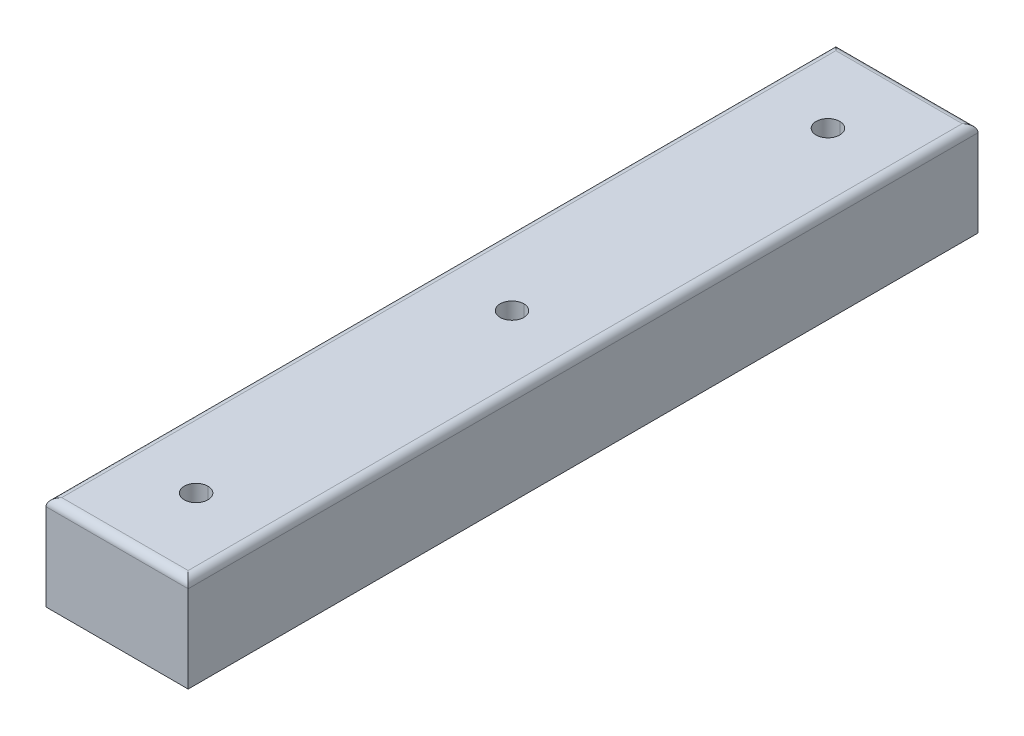
ISO-10303-21;
HEADER;
FILE_DESCRIPTION(('STEP AP214'),'2;1');
FILE_NAME('part.step','',(''),(''),'','','');
FILE_SCHEMA(('AUTOMOTIVE_DESIGN { 1 0 10303 214 1 1 1 1 }'));
ENDSEC;
DATA;
#1=APPLICATION_CONTEXT('core data for automotive mechanical design processes');
#2=APPLICATION_PROTOCOL_DEFINITION('international standard','automotive_design',2000,#1);
#3=PRODUCT_CONTEXT('',#1,'mechanical');
#4=PRODUCT('Part','Part','',(#3));
#5=PRODUCT_RELATED_PRODUCT_CATEGORY('part','',(#4));
#6=PRODUCT_DEFINITION_FORMATION('','',#4);
#7=PRODUCT_DEFINITION_CONTEXT('part definition',#1,'design');
#8=PRODUCT_DEFINITION('design','',#6,#7);
#9=PRODUCT_DEFINITION_SHAPE('','',#8);
#10=(LENGTH_UNIT() NAMED_UNIT(*) SI_UNIT(.MILLI.,.METRE.));
#11=(NAMED_UNIT(*) PLANE_ANGLE_UNIT() SI_UNIT($,.RADIAN.));
#12=(NAMED_UNIT(*) SI_UNIT($,.STERADIAN.) SOLID_ANGLE_UNIT());
#13=UNCERTAINTY_MEASURE_WITH_UNIT(LENGTH_MEASURE(1.E-05),#10,'distance_accuracy_value','');
#14=(GEOMETRIC_REPRESENTATION_CONTEXT(3) GLOBAL_UNCERTAINTY_ASSIGNED_CONTEXT((#13)) GLOBAL_UNIT_ASSIGNED_CONTEXT((#10,
#11,#12)) REPRESENTATION_CONTEXT('',''));
#15=CARTESIAN_POINT('',(0.,0.,0.));
#16=DIRECTION('',(0.,0.,1.));
#17=DIRECTION('',(1.,0.,0.));
#18=AXIS2_PLACEMENT_3D('',#15,#16,#17);
#19=CARTESIAN_POINT('',(0.,-40.,100.));
#20=DIRECTION('',(0.,1.,0.));
#21=DIRECTION('',(1.,0.,0.));
#22=AXIS2_PLACEMENT_3D('',#19,#20,#21);
#23=PLANE('',#22);
#24=CARTESIAN_POINT('',(0.,-40.,100.));
#25=DIRECTION('',(0.,1.,0.));
#26=DIRECTION('',(0.,0.,1.));
#27=AXIS2_PLACEMENT_3D('',#24,#25,#26);
#28=CIRCLE('',#27,15.);
#29=CARTESIAN_POINT('',(0.,-40.,115.));
#30=VERTEX_POINT('',#29);
#31=CARTESIAN_POINT('',(0.,-40.,85.));
#32=VERTEX_POINT('',#31);
#33=EDGE_CURVE('E11',#30,#32,#28,.T.);
#34=ORIENTED_EDGE('',*,*,#33,.T.);
#35=CARTESIAN_POINT('',(0.,-40.,100.));
#36=DIRECTION('',(0.,1.,0.));
#37=DIRECTION('',(0.,0.,1.));
#38=AXIS2_PLACEMENT_3D('',#35,#36,#37);
#39=CIRCLE('',#38,15.);
#40=EDGE_CURVE('E208',#32,#30,#39,.T.);
#41=ORIENTED_EDGE('',*,*,#40,.T.);
#42=EDGE_LOOP('',(#34,#41));
#43=FACE_BOUND('',#42,.T.);
#44=ADVANCED_FACE('F17',(#43),#23,.T.);
#45=CARTESIAN_POINT('',(0.,-40.,100.));
#46=DIRECTION('',(0.,1.,0.));
#47=DIRECTION('',(0.,0.,1.));
#48=AXIS2_PLACEMENT_3D('',#45,#46,#47);
#49=CYLINDRICAL_SURFACE('',#48,15.);
#50=DIRECTION('',(0.,1.,0.));
#51=VECTOR('',#50,1.);
#52=CARTESIAN_POINT('',(0.,-40.,85.));
#53=LINE('',#52,#51);
#54=CARTESIAN_POINT('',(0.,60.,85.));
#55=VERTEX_POINT('',#54);
#56=EDGE_CURVE('E212',#32,#55,#53,.T.);
#57=ORIENTED_EDGE('',*,*,#56,.F.);
#58=ORIENTED_EDGE('',*,*,#33,.F.);
#59=DIRECTION('',(0.,1.,0.));
#60=VECTOR('',#59,1.);
#61=CARTESIAN_POINT('',(0.,-40.,115.));
#62=LINE('',#61,#60);
#63=CARTESIAN_POINT('',(0.,60.,115.));
#64=VERTEX_POINT('',#63);
#65=EDGE_CURVE('E189',#30,#64,#62,.T.);
#66=ORIENTED_EDGE('',*,*,#65,.T.);
#67=CARTESIAN_POINT('',(0.,60.,100.));
#68=DIRECTION('',(0.,1.,0.));
#69=DIRECTION('',(0.,0.,1.));
#70=AXIS2_PLACEMENT_3D('',#67,#68,#69);
#71=CIRCLE('',#70,15.);
#72=EDGE_CURVE('E117',#64,#55,#71,.T.);
#73=ORIENTED_EDGE('',*,*,#72,.T.);
#74=EDGE_LOOP('',(#57,#58,#66,#73));
#75=FACE_BOUND('',#74,.T.);
#76=ADVANCED_FACE('F441',(#75),#49,.F.);
#77=CARTESIAN_POINT('',(0.,-40.,500.));
#78=DIRECTION('',(0.,1.,0.));
#79=DIRECTION('',(1.,0.,0.));
#80=AXIS2_PLACEMENT_3D('',#77,#78,#79);
#81=PLANE('',#80);
#82=CARTESIAN_POINT('',(0.,-40.,500.));
#83=DIRECTION('',(0.,1.,0.));
#84=DIRECTION('',(0.,0.,1.));
#85=AXIS2_PLACEMENT_3D('',#82,#83,#84);
#86=CIRCLE('',#85,15.);
#87=CARTESIAN_POINT('',(0.,-40.,515.));
#88=VERTEX_POINT('',#87);
#89=CARTESIAN_POINT('',(0.,-40.,485.));
#90=VERTEX_POINT('',#89);
#91=EDGE_CURVE('E28',#88,#90,#86,.T.);
#92=ORIENTED_EDGE('',*,*,#91,.T.);
#93=CARTESIAN_POINT('',(0.,-40.,500.));
#94=DIRECTION('',(0.,1.,0.));
#95=DIRECTION('',(0.,0.,1.));
#96=AXIS2_PLACEMENT_3D('',#93,#94,#95);
#97=CIRCLE('',#96,15.);
#98=EDGE_CURVE('E192',#90,#88,#97,.T.);
#99=ORIENTED_EDGE('',*,*,#98,.T.);
#100=EDGE_LOOP('',(#92,#99));
#101=FACE_BOUND('',#100,.T.);
#102=ADVANCED_FACE('F428',(#101),#81,.T.);
#103=CARTESIAN_POINT('',(0.,-40.,500.));
#104=DIRECTION('',(0.,1.,0.));
#105=DIRECTION('',(0.,0.,1.));
#106=AXIS2_PLACEMENT_3D('',#103,#104,#105);
#107=CYLINDRICAL_SURFACE('',#106,15.);
#108=DIRECTION('',(0.,1.,0.));
#109=VECTOR('',#108,1.);
#110=CARTESIAN_POINT('',(0.,-40.,485.));
#111=LINE('',#110,#109);
#112=CARTESIAN_POINT('',(0.,60.,485.));
#113=VERTEX_POINT('',#112);
#114=EDGE_CURVE('E178',#90,#113,#111,.T.);
#115=ORIENTED_EDGE('',*,*,#114,.F.);
#116=ORIENTED_EDGE('',*,*,#91,.F.);
#117=DIRECTION('',(0.,1.,0.));
#118=VECTOR('',#117,1.);
#119=CARTESIAN_POINT('',(0.,-40.,515.));
#120=LINE('',#119,#118);
#121=CARTESIAN_POINT('',(0.,60.,515.));
#122=VERTEX_POINT('',#121);
#123=EDGE_CURVE('E177',#88,#122,#120,.T.);
#124=ORIENTED_EDGE('',*,*,#123,.T.);
#125=CARTESIAN_POINT('',(0.,60.,500.));
#126=DIRECTION('',(0.,1.,0.));
#127=DIRECTION('',(0.,0.,1.));
#128=AXIS2_PLACEMENT_3D('',#125,#126,#127);
#129=CIRCLE('',#128,15.);
#130=EDGE_CURVE('E216',#122,#113,#129,.T.);
#131=ORIENTED_EDGE('',*,*,#130,.T.);
#132=EDGE_LOOP('',(#115,#116,#124,#131));
#133=FACE_BOUND('',#132,.T.);
#134=ADVANCED_FACE('F423',(#133),#107,.F.);
#135=CARTESIAN_POINT('',(0.,-40.,900.));
#136=DIRECTION('',(0.,1.,0.));
#137=DIRECTION('',(1.,0.,0.));
#138=AXIS2_PLACEMENT_3D('',#135,#136,#137);
#139=PLANE('',#138);
#140=CARTESIAN_POINT('',(0.,-40.,900.));
#141=DIRECTION('',(0.,1.,0.));
#142=DIRECTION('',(0.,0.,1.));
#143=AXIS2_PLACEMENT_3D('',#140,#141,#142);
#144=CIRCLE('',#143,15.);
#145=CARTESIAN_POINT('',(0.,-40.,915.));
#146=VERTEX_POINT('',#145);
#147=CARTESIAN_POINT('',(0.,-40.,885.));
#148=VERTEX_POINT('',#147);
#149=EDGE_CURVE('E243',#146,#148,#144,.T.);
#150=ORIENTED_EDGE('',*,*,#149,.T.);
#151=CARTESIAN_POINT('',(0.,-40.,900.));
#152=DIRECTION('',(0.,1.,0.));
#153=DIRECTION('',(0.,0.,1.));
#154=AXIS2_PLACEMENT_3D('',#151,#152,#153);
#155=CIRCLE('',#154,15.);
#156=EDGE_CURVE('E207',#148,#146,#155,.T.);
#157=ORIENTED_EDGE('',*,*,#156,.T.);
#158=EDGE_LOOP('',(#150,#157));
#159=FACE_BOUND('',#158,.T.);
#160=ADVANCED_FACE('F268',(#159),#139,.T.);
#161=CARTESIAN_POINT('',(0.,-40.,900.));
#162=DIRECTION('',(0.,1.,0.));
#163=DIRECTION('',(0.,0.,1.));
#164=AXIS2_PLACEMENT_3D('',#161,#162,#163);
#165=CYLINDRICAL_SURFACE('',#164,15.);
#166=DIRECTION('',(0.,1.,0.));
#167=VECTOR('',#166,1.);
#168=CARTESIAN_POINT('',(0.,-40.,885.));
#169=LINE('',#168,#167);
#170=CARTESIAN_POINT('',(0.,60.,885.));
#171=VERTEX_POINT('',#170);
#172=EDGE_CURVE('E203',#148,#171,#169,.T.);
#173=ORIENTED_EDGE('',*,*,#172,.F.);
#174=ORIENTED_EDGE('',*,*,#149,.F.);
#175=DIRECTION('',(0.,1.,0.));
#176=VECTOR('',#175,1.);
#177=CARTESIAN_POINT('',(0.,-40.,915.));
#178=LINE('',#177,#176);
#179=CARTESIAN_POINT('',(0.,60.,915.));
#180=VERTEX_POINT('',#179);
#181=EDGE_CURVE('E179',#146,#180,#178,.T.);
#182=ORIENTED_EDGE('',*,*,#181,.T.);
#183=CARTESIAN_POINT('',(0.,60.,900.));
#184=DIRECTION('',(0.,1.,0.));
#185=DIRECTION('',(0.,0.,1.));
#186=AXIS2_PLACEMENT_3D('',#183,#184,#185);
#187=CIRCLE('',#186,15.);
#188=EDGE_CURVE('E219',#180,#171,#187,.T.);
#189=ORIENTED_EDGE('',*,*,#188,.T.);
#190=EDGE_LOOP('',(#173,#174,#182,#189));
#191=FACE_BOUND('',#190,.T.);
#192=ADVANCED_FACE('F256',(#191),#165,.F.);
#193=CARTESIAN_POINT('',(80.,50.,1000.));
#194=DIRECTION('',(0.,0.,-1.));
#195=DIRECTION('',(-1.,0.,0.));
#196=AXIS2_PLACEMENT_3D('',#193,#194,#195);
#197=CYLINDRICAL_SURFACE('',#196,10.);
#198=CARTESIAN_POINT('',(80.,60.,990.));
#199=CARTESIAN_POINT('',(85.857864376269,60.,995.85786437627));
#200=CARTESIAN_POINT('',(89.9999999999999,55.857864376269,1000.));
#201=CARTESIAN_POINT('',(90.,50.,1000.));
#202=(BOUNDED_CURVE() B_SPLINE_CURVE(3,(#198,#199,#200,#201),.UNSPECIFIED.,.F.,
.F.) B_SPLINE_CURVE_WITH_KNOTS((4,4),(4.71238898038469,6.28318530717959),
.UNSPECIFIED.) CURVE() GEOMETRIC_REPRESENTATION_ITEM() RATIONAL_B_SPLINE_CURVE((1.,
0.804737854124365,0.804737854124365,1.)) REPRESENTATION_ITEM(''));
#203=CARTESIAN_POINT('',(80.,60.,990.));
#204=VERTEX_POINT('',#203);
#205=CARTESIAN_POINT('',(90.,50.,1000.));
#206=VERTEX_POINT('',#205);
#207=EDGE_CURVE('E234',#204,#206,#202,.T.);
#208=ORIENTED_EDGE('',*,*,#207,.T.);
#209=DIRECTION('',(0.,0.,1.));
#210=VECTOR('',#209,1.);
#211=CARTESIAN_POINT('',(90.,50.,1000.));
#212=LINE('',#211,#210);
#213=CARTESIAN_POINT('',(90.,50.,0.));
#214=VERTEX_POINT('',#213);
#215=EDGE_CURVE('E188',#214,#206,#212,.T.);
#216=ORIENTED_EDGE('',*,*,#215,.F.);
#217=CARTESIAN_POINT('',(90.,50.,0.));
#218=CARTESIAN_POINT('',(89.9999999999999,55.857864376269,0.));
#219=CARTESIAN_POINT('',(85.857864376269,60.,4.14213562373096));
#220=CARTESIAN_POINT('',(80.,60.,10.));
#221=(BOUNDED_CURVE() B_SPLINE_CURVE(3,(#217,#218,#219,#220),.UNSPECIFIED.,.F.,
.F.) B_SPLINE_CURVE_WITH_KNOTS((4,4),(3.1415926535898,4.71238898038469),
.UNSPECIFIED.) CURVE() GEOMETRIC_REPRESENTATION_ITEM() RATIONAL_B_SPLINE_CURVE((1.,
0.804737854124365,0.804737854124365,1.)) REPRESENTATION_ITEM(''));
#222=CARTESIAN_POINT('',(80.,60.,10.));
#223=VERTEX_POINT('',#222);
#224=EDGE_CURVE('E235',#214,#223,#221,.T.);
#225=ORIENTED_EDGE('',*,*,#224,.T.);
#226=DIRECTION('',(0.,0.,-1.));
#227=VECTOR('',#226,1.);
#228=CARTESIAN_POINT('',(80.,60.,1000.));
#229=LINE('',#228,#227);
#230=EDGE_CURVE('E160',#204,#223,#229,.T.);
#231=ORIENTED_EDGE('',*,*,#230,.F.);
#232=EDGE_LOOP('',(#208,#216,#225,#231));
#233=FACE_BOUND('',#232,.T.);
#234=ADVANCED_FACE('F322',(#233),#197,.T.);
#235=CARTESIAN_POINT('',(-90.,50.,10.));
#236=DIRECTION('',(-1.,0.,0.));
#237=DIRECTION('',(0.,0.,1.));
#238=AXIS2_PLACEMENT_3D('',#235,#236,#237);
#239=CYLINDRICAL_SURFACE('',#238,10.);
#240=CARTESIAN_POINT('',(-90.,50.,0.));
#241=CARTESIAN_POINT('',(-90.0000000000001,55.857864376269,0.));
#242=CARTESIAN_POINT('',(-85.857864376269,60.,4.14213562373096));
#243=CARTESIAN_POINT('',(-80.,60.,10.));
#244=(BOUNDED_CURVE() B_SPLINE_CURVE(3,(#240,#241,#242,#243),.UNSPECIFIED.,.F.,
.F.) B_SPLINE_CURVE_WITH_KNOTS((4,4),(0.,1.5707963267949),
.UNSPECIFIED.) CURVE() GEOMETRIC_REPRESENTATION_ITEM() RATIONAL_B_SPLINE_CURVE((1.,
0.804737854124365,0.804737854124365,1.)) REPRESENTATION_ITEM(''));
#245=CARTESIAN_POINT('',(-90.,50.,0.));
#246=VERTEX_POINT('',#245);
#247=CARTESIAN_POINT('',(-80.,60.,10.));
#248=VERTEX_POINT('',#247);
#249=EDGE_CURVE('E135',#246,#248,#244,.T.);
#250=ORIENTED_EDGE('',*,*,#249,.T.);
#251=DIRECTION('',(-1.,0.,0.));
#252=VECTOR('',#251,1.);
#253=CARTESIAN_POINT('',(-90.,60.,10.));
#254=LINE('',#253,#252);
#255=EDGE_CURVE('E139',#223,#248,#254,.T.);
#256=ORIENTED_EDGE('',*,*,#255,.F.);
#257=ORIENTED_EDGE('',*,*,#224,.F.);
#258=DIRECTION('',(1.,0.,0.));
#259=VECTOR('',#258,1.);
#260=CARTESIAN_POINT('',(0.,50.,0.));
#261=LINE('',#260,#259);
#262=EDGE_CURVE('E142',#246,#214,#261,.T.);
#263=ORIENTED_EDGE('',*,*,#262,.F.);
#264=EDGE_LOOP('',(#250,#256,#257,#263));
#265=FACE_BOUND('',#264,.T.);
#266=ADVANCED_FACE('F137',(#265),#239,.T.);
#267=CARTESIAN_POINT('',(0.,50.,990.));
#268=DIRECTION('',(1.,0.,0.));
#269=DIRECTION('',(0.,0.,-1.));
#270=AXIS2_PLACEMENT_3D('',#267,#268,#269);
#271=CYLINDRICAL_SURFACE('',#270,10.);
#272=CARTESIAN_POINT('',(-80.,60.,990.));
#273=CARTESIAN_POINT('',(-85.857864376269,60.,995.85786437627));
#274=CARTESIAN_POINT('',(-90.0000000000001,55.857864376269,1000.));
#275=CARTESIAN_POINT('',(-90.,50.,1000.));
#276=(BOUNDED_CURVE() B_SPLINE_CURVE(3,(#272,#273,#274,#275),.UNSPECIFIED.,.F.,
.F.) B_SPLINE_CURVE_WITH_KNOTS((4,4),(1.5707963267949,3.1415926535898),
.UNSPECIFIED.) CURVE() GEOMETRIC_REPRESENTATION_ITEM() RATIONAL_B_SPLINE_CURVE((1.,
0.804737854124365,0.804737854124365,1.)) REPRESENTATION_ITEM(''));
#277=CARTESIAN_POINT('',(-80.,60.,990.));
#278=VERTEX_POINT('',#277);
#279=CARTESIAN_POINT('',(-90.,50.,1000.));
#280=VERTEX_POINT('',#279);
#281=EDGE_CURVE('E146',#278,#280,#276,.T.);
#282=ORIENTED_EDGE('',*,*,#281,.T.);
#283=DIRECTION('',(-1.,0.,0.));
#284=VECTOR('',#283,1.);
#285=CARTESIAN_POINT('',(-90.,50.,1000.));
#286=LINE('',#285,#284);
#287=EDGE_CURVE('E198',#206,#280,#286,.T.);
#288=ORIENTED_EDGE('',*,*,#287,.F.);
#289=ORIENTED_EDGE('',*,*,#207,.F.);
#290=DIRECTION('',(1.,0.,0.));
#291=VECTOR('',#290,1.);
#292=CARTESIAN_POINT('',(90.,60.,990.));
#293=LINE('',#292,#291);
#294=EDGE_CURVE('E168',#278,#204,#293,.T.);
#295=ORIENTED_EDGE('',*,*,#294,.F.);
#296=EDGE_LOOP('',(#282,#288,#289,#295));
#297=FACE_BOUND('',#296,.T.);
#298=ADVANCED_FACE('F324',(#297),#271,.T.);
#299=CARTESIAN_POINT('',(-80.,50.,1000.));
#300=DIRECTION('',(0.,0.,-1.));
#301=DIRECTION('',(-1.,0.,0.));
#302=AXIS2_PLACEMENT_3D('',#299,#300,#301);
#303=CYLINDRICAL_SURFACE('',#302,10.);
#304=ORIENTED_EDGE('',*,*,#249,.F.);
#305=DIRECTION('',(0.,0.,-1.));
#306=VECTOR('',#305,1.);
#307=CARTESIAN_POINT('',(-90.,50.,1000.));
#308=LINE('',#307,#306);
#309=EDGE_CURVE('E224',#280,#246,#308,.T.);
#310=ORIENTED_EDGE('',*,*,#309,.F.);
#311=ORIENTED_EDGE('',*,*,#281,.F.);
#312=DIRECTION('',(0.,0.,1.));
#313=VECTOR('',#312,1.);
#314=CARTESIAN_POINT('',(-80.,60.,1000.));
#315=LINE('',#314,#313);
#316=EDGE_CURVE('E150',#248,#278,#315,.T.);
#317=ORIENTED_EDGE('',*,*,#316,.F.);
#318=EDGE_LOOP('',(#304,#310,#311,#317));
#319=FACE_BOUND('',#318,.T.);
#320=ADVANCED_FACE('F151',(#319),#303,.T.);
#321=CARTESIAN_POINT('',(0.,0.,0.));
#322=DIRECTION('',(0.,0.,1.));
#323=DIRECTION('',(1.,0.,0.));
#324=AXIS2_PLACEMENT_3D('',#321,#322,#323);
#325=PLANE('',#324);
#326=DIRECTION('',(0.,-1.,0.));
#327=VECTOR('',#326,1.);
#328=CARTESIAN_POINT('',(-90.,60.,0.));
#329=LINE('',#328,#327);
#330=CARTESIAN_POINT('',(-90.,-60.,0.));
#331=VERTEX_POINT('',#330);
#332=EDGE_CURVE('E279',#246,#331,#329,.T.);
#333=ORIENTED_EDGE('',*,*,#332,.F.);
#334=ORIENTED_EDGE('',*,*,#262,.T.);
#335=DIRECTION('',(0.,1.,0.));
#336=VECTOR('',#335,1.);
#337=CARTESIAN_POINT('',(90.,60.,0.));
#338=LINE('',#337,#336);
#339=CARTESIAN_POINT('',(90.,-60.,0.));
#340=VERTEX_POINT('',#339);
#341=EDGE_CURVE('E183',#340,#214,#338,.T.);
#342=ORIENTED_EDGE('',*,*,#341,.F.);
#343=DIRECTION('',(1.,0.,0.));
#344=VECTOR('',#343,1.);
#345=CARTESIAN_POINT('',(-90.,-60.,0.));
#346=LINE('',#345,#344);
#347=EDGE_CURVE('E43',#331,#340,#346,.T.);
#348=ORIENTED_EDGE('',*,*,#347,.F.);
#349=EDGE_LOOP('',(#333,#334,#342,#348));
#350=FACE_BOUND('',#349,.T.);
#351=ADVANCED_FACE('F332',(#350),#325,.F.);
#352=CARTESIAN_POINT('',(0.,0.,1000.));
#353=DIRECTION('',(0.,0.,1.));
#354=DIRECTION('',(1.,0.,0.));
#355=AXIS2_PLACEMENT_3D('',#352,#353,#354);
#356=PLANE('',#355);
#357=DIRECTION('',(0.,1.,0.));
#358=VECTOR('',#357,1.);
#359=CARTESIAN_POINT('',(90.,60.,1000.));
#360=LINE('',#359,#358);
#361=CARTESIAN_POINT('',(90.,-60.,1000.));
#362=VERTEX_POINT('',#361);
#363=EDGE_CURVE('E194',#362,#206,#360,.T.);
#364=ORIENTED_EDGE('',*,*,#363,.T.);
#365=ORIENTED_EDGE('',*,*,#287,.T.);
#366=DIRECTION('',(0.,-1.,0.));
#367=VECTOR('',#366,1.);
#368=CARTESIAN_POINT('',(-90.,60.,1000.));
#369=LINE('',#368,#367);
#370=CARTESIAN_POINT('',(-90.,-60.,1000.));
#371=VERTEX_POINT('',#370);
#372=EDGE_CURVE('E220',#280,#371,#369,.T.);
#373=ORIENTED_EDGE('',*,*,#372,.T.);
#374=DIRECTION('',(1.,0.,0.));
#375=VECTOR('',#374,1.);
#376=CARTESIAN_POINT('',(-90.,-60.,1000.));
#377=LINE('',#376,#375);
#378=EDGE_CURVE('E201',#371,#362,#377,.T.);
#379=ORIENTED_EDGE('',*,*,#378,.T.);
#380=EDGE_LOOP('',(#364,#365,#373,#379));
#381=FACE_BOUND('',#380,.T.);
#382=ADVANCED_FACE('F327',(#381),#356,.T.);
#383=CARTESIAN_POINT('',(-90.,-60.,1000.));
#384=DIRECTION('',(0.,1.,0.));
#385=DIRECTION('',(1.,0.,0.));
#386=AXIS2_PLACEMENT_3D('',#383,#384,#385);
#387=PLANE('',#386);
#388=ORIENTED_EDGE('',*,*,#347,.T.);
#389=DIRECTION('',(0.,0.,-1.));
#390=VECTOR('',#389,1.);
#391=CARTESIAN_POINT('',(90.,-60.,1000.));
#392=LINE('',#391,#390);
#393=EDGE_CURVE('E172',#362,#340,#392,.T.);
#394=ORIENTED_EDGE('',*,*,#393,.F.);
#395=ORIENTED_EDGE('',*,*,#378,.F.);
#396=DIRECTION('',(0.,0.,-1.));
#397=VECTOR('',#396,1.);
#398=CARTESIAN_POINT('',(-90.,-60.,1000.));
#399=LINE('',#398,#397);
#400=EDGE_CURVE('E21',#371,#331,#399,.T.);
#401=ORIENTED_EDGE('',*,*,#400,.T.);
#402=EDGE_LOOP('',(#388,#394,#395,#401));
#403=FACE_BOUND('',#402,.T.);
#404=ADVANCED_FACE('F364',(#403),#387,.F.);
#405=CARTESIAN_POINT('',(-90.,60.,1000.));
#406=DIRECTION('',(1.,0.,0.));
#407=DIRECTION('',(0.,1.,0.));
#408=AXIS2_PLACEMENT_3D('',#405,#406,#407);
#409=PLANE('',#408);
#410=ORIENTED_EDGE('',*,*,#372,.F.);
#411=ORIENTED_EDGE('',*,*,#309,.T.);
#412=ORIENTED_EDGE('',*,*,#332,.T.);
#413=ORIENTED_EDGE('',*,*,#400,.F.);
#414=EDGE_LOOP('',(#410,#411,#412,#413));
#415=FACE_BOUND('',#414,.T.);
#416=ADVANCED_FACE('F337',(#415),#409,.F.);
#417=CARTESIAN_POINT('',(-90.,60.,1000.));
#418=DIRECTION('',(0.,-1.,0.));
#419=DIRECTION('',(0.,0.,-1.));
#420=AXIS2_PLACEMENT_3D('',#417,#418,#419);
#421=PLANE('',#420);
#422=ORIENTED_EDGE('',*,*,#188,.F.);
#423=CARTESIAN_POINT('',(0.,60.,900.));
#424=DIRECTION('',(0.,1.,0.));
#425=DIRECTION('',(0.,0.,1.));
#426=AXIS2_PLACEMENT_3D('',#423,#424,#425);
#427=CIRCLE('',#426,15.);
#428=EDGE_CURVE('E184',#171,#180,#427,.T.);
#429=ORIENTED_EDGE('',*,*,#428,.F.);
#430=EDGE_LOOP('',(#422,#429));
#431=FACE_BOUND('',#430,.T.);
#432=ORIENTED_EDGE('',*,*,#130,.F.);
#433=CARTESIAN_POINT('',(0.,60.,500.));
#434=DIRECTION('',(0.,1.,0.));
#435=DIRECTION('',(0.,0.,1.));
#436=AXIS2_PLACEMENT_3D('',#433,#434,#435);
#437=CIRCLE('',#436,15.);
#438=EDGE_CURVE('E174',#113,#122,#437,.T.);
#439=ORIENTED_EDGE('',*,*,#438,.F.);
#440=EDGE_LOOP('',(#432,#439));
#441=FACE_BOUND('',#440,.T.);
#442=ORIENTED_EDGE('',*,*,#72,.F.);
#443=CARTESIAN_POINT('',(0.,60.,100.));
#444=DIRECTION('',(0.,1.,0.));
#445=DIRECTION('',(0.,0.,1.));
#446=AXIS2_PLACEMENT_3D('',#443,#444,#445);
#447=CIRCLE('',#446,15.);
#448=EDGE_CURVE('E193',#55,#64,#447,.T.);
#449=ORIENTED_EDGE('',*,*,#448,.F.);
#450=EDGE_LOOP('',(#442,#449));
#451=FACE_BOUND('',#450,.T.);
#452=ORIENTED_EDGE('',*,*,#294,.T.);
#453=ORIENTED_EDGE('',*,*,#230,.T.);
#454=ORIENTED_EDGE('',*,*,#255,.T.);
#455=ORIENTED_EDGE('',*,*,#316,.T.);
#456=EDGE_LOOP('',(#452,#453,#454,#455));
#457=FACE_BOUND('',#456,.T.);
#458=ADVANCED_FACE('F158',(#431,#441,#451,#457),#421,.F.);
#459=CARTESIAN_POINT('',(90.,60.,1000.));
#460=DIRECTION('',(-1.,0.,0.));
#461=DIRECTION('',(0.,1.,0.));
#462=AXIS2_PLACEMENT_3D('',#459,#460,#461);
#463=PLANE('',#462);
#464=ORIENTED_EDGE('',*,*,#341,.T.);
#465=ORIENTED_EDGE('',*,*,#215,.T.);
#466=ORIENTED_EDGE('',*,*,#363,.F.);
#467=ORIENTED_EDGE('',*,*,#393,.T.);
#468=EDGE_LOOP('',(#464,#465,#466,#467));
#469=FACE_BOUND('',#468,.T.);
#470=ADVANCED_FACE('F331',(#469),#463,.F.);
#471=CARTESIAN_POINT('',(0.,-40.,900.));
#472=DIRECTION('',(0.,1.,0.));
#473=DIRECTION('',(0.,0.,1.));
#474=AXIS2_PLACEMENT_3D('',#471,#472,#473);
#475=CYLINDRICAL_SURFACE('',#474,15.);
#476=ORIENTED_EDGE('',*,*,#156,.F.);
#477=ORIENTED_EDGE('',*,*,#172,.T.);
#478=ORIENTED_EDGE('',*,*,#428,.T.);
#479=ORIENTED_EDGE('',*,*,#181,.F.);
#480=EDGE_LOOP('',(#476,#477,#478,#479));
#481=FACE_BOUND('',#480,.T.);
#482=ADVANCED_FACE('F266',(#481),#475,.F.);
#483=CARTESIAN_POINT('',(0.,-40.,500.));
#484=DIRECTION('',(0.,1.,0.));
#485=DIRECTION('',(0.,0.,1.));
#486=AXIS2_PLACEMENT_3D('',#483,#484,#485);
#487=CYLINDRICAL_SURFACE('',#486,15.);
#488=ORIENTED_EDGE('',*,*,#98,.F.);
#489=ORIENTED_EDGE('',*,*,#114,.T.);
#490=ORIENTED_EDGE('',*,*,#438,.T.);
#491=ORIENTED_EDGE('',*,*,#123,.F.);
#492=EDGE_LOOP('',(#488,#489,#490,#491));
#493=FACE_BOUND('',#492,.T.);
#494=ADVANCED_FACE('F472',(#493),#487,.F.);
#495=CARTESIAN_POINT('',(0.,-40.,100.));
#496=DIRECTION('',(0.,1.,0.));
#497=DIRECTION('',(0.,0.,1.));
#498=AXIS2_PLACEMENT_3D('',#495,#496,#497);
#499=CYLINDRICAL_SURFACE('',#498,15.);
#500=ORIENTED_EDGE('',*,*,#40,.F.);
#501=ORIENTED_EDGE('',*,*,#56,.T.);
#502=ORIENTED_EDGE('',*,*,#448,.T.);
#503=ORIENTED_EDGE('',*,*,#65,.F.);
#504=EDGE_LOOP('',(#500,#501,#502,#503));
#505=FACE_BOUND('',#504,.T.);
#506=ADVANCED_FACE('F19',(#505),#499,.F.);
#507=CLOSED_SHELL('',(#44,#76,#102,#134,#160,#192,#234,#266,#298,#320,#351,#382,#404,#416,#458,
#470,#482,#494,#506));
#508=MANIFOLD_SOLID_BREP('B1',#507);
#509=ADVANCED_BREP_SHAPE_REPRESENTATION('',(#18,#508),#14);
#510=SHAPE_DEFINITION_REPRESENTATION(#9,#509);
ENDSEC;
END-ISO-10303-21;
